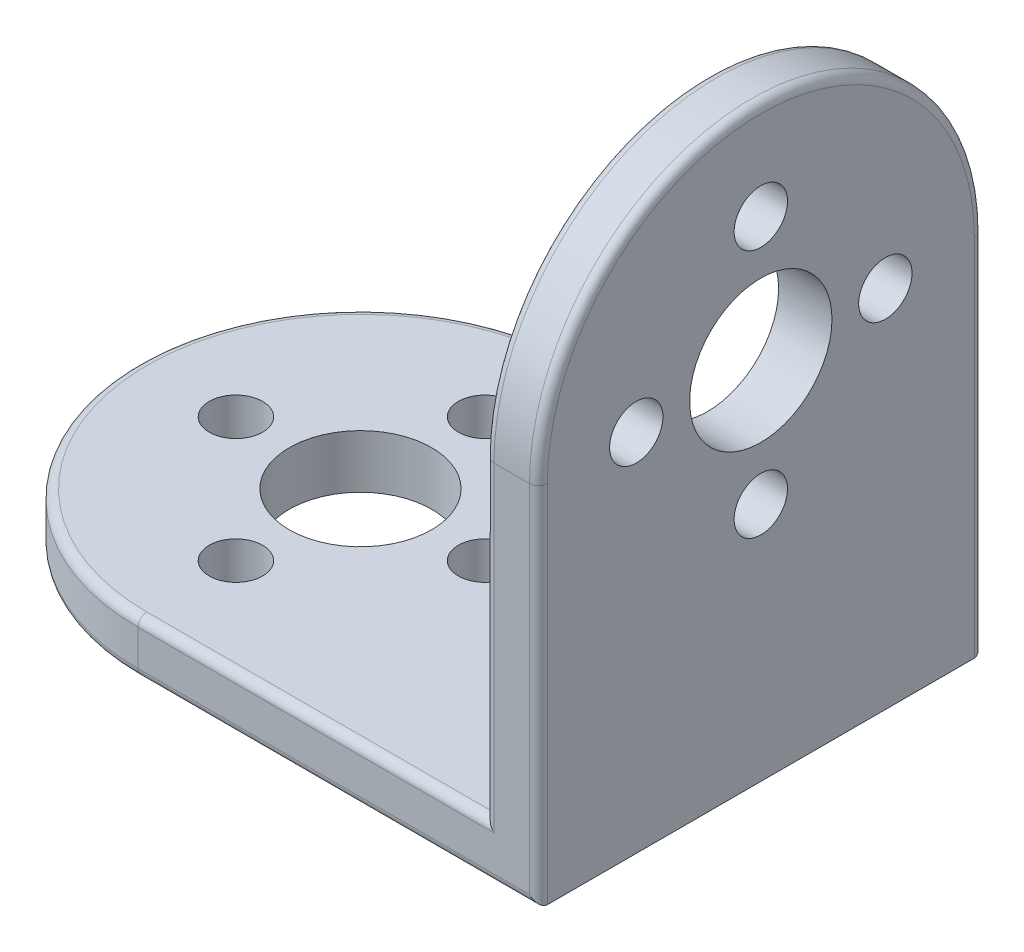
ISO-10303-21;
HEADER;
FILE_DESCRIPTION(('STEP AP214'),'2;1');
FILE_NAME('part.step','',(''),(''),'','','');
FILE_SCHEMA(('AUTOMOTIVE_DESIGN { 1 0 10303 214 1 1 1 1 }'));
ENDSEC;
DATA;
#1=APPLICATION_CONTEXT('core data for automotive mechanical design processes');
#2=APPLICATION_PROTOCOL_DEFINITION('international standard','automotive_design',2000,#1);
#3=PRODUCT_CONTEXT('',#1,'mechanical');
#4=PRODUCT('Part','Part','',(#3));
#5=PRODUCT_RELATED_PRODUCT_CATEGORY('part','',(#4));
#6=PRODUCT_DEFINITION_FORMATION('','',#4);
#7=PRODUCT_DEFINITION_CONTEXT('part definition',#1,'design');
#8=PRODUCT_DEFINITION('design','',#6,#7);
#9=PRODUCT_DEFINITION_SHAPE('','',#8);
#10=(LENGTH_UNIT() NAMED_UNIT(*) SI_UNIT(.MILLI.,.METRE.));
#11=(NAMED_UNIT(*) PLANE_ANGLE_UNIT() SI_UNIT($,.RADIAN.));
#12=(NAMED_UNIT(*) SI_UNIT($,.STERADIAN.) SOLID_ANGLE_UNIT());
#13=UNCERTAINTY_MEASURE_WITH_UNIT(LENGTH_MEASURE(1.E-05),#10,'distance_accuracy_value','');
#14=(GEOMETRIC_REPRESENTATION_CONTEXT(3) GLOBAL_UNCERTAINTY_ASSIGNED_CONTEXT((#13)) GLOBAL_UNIT_ASSIGNED_CONTEXT((#10,
#11,#12)) REPRESENTATION_CONTEXT('',''));
#15=CARTESIAN_POINT('',(0.,0.,0.));
#16=DIRECTION('',(0.,0.,1.));
#17=DIRECTION('',(1.,0.,0.));
#18=AXIS2_PLACEMENT_3D('',#15,#16,#17);
#19=CARTESIAN_POINT('',(17.5,3.,-12.5));
#20=DIRECTION('',(1.,0.,0.));
#21=DIRECTION('',(0.,0.,-1.));
#22=AXIS2_PLACEMENT_3D('',#19,#20,#21);
#23=PLANE('',#22);
#24=DIRECTION('',(0.,0.,1.));
#25=VECTOR('',#24,1.);
#26=CARTESIAN_POINT('',(17.5,0.,-12.5));
#27=LINE('',#26,#25);
#28=CARTESIAN_POINT('',(17.5,0.,-12.));
#29=VERTEX_POINT('',#28);
#30=CARTESIAN_POINT('',(17.5,0.,12.));
#31=VERTEX_POINT('',#30);
#32=EDGE_CURVE('E317',#29,#31,#27,.T.);
#33=ORIENTED_EDGE('',*,*,#32,.F.);
#34=DIRECTION('',(0.,-1.,0.));
#35=VECTOR('',#34,1.);
#36=CARTESIAN_POINT('',(17.5,3.,-12.));
#37=LINE('',#36,#35);
#38=CARTESIAN_POINT('',(17.5,20.5,-12.));
#39=VERTEX_POINT('',#38);
#40=EDGE_CURVE('E257',#29,#39,#37,.F.);
#41=ORIENTED_EDGE('',*,*,#40,.T.);
#42=CARTESIAN_POINT('',(17.5,20.5,0.));
#43=DIRECTION('',(1.,0.,0.));
#44=DIRECTION('',(0.,0.,-1.));
#45=AXIS2_PLACEMENT_3D('',#42,#43,#44);
#46=CIRCLE('',#45,12.);
#47=CARTESIAN_POINT('',(17.5,20.5,12.));
#48=VERTEX_POINT('',#47);
#49=EDGE_CURVE('E263',#39,#48,#46,.T.);
#50=ORIENTED_EDGE('',*,*,#49,.T.);
#51=DIRECTION('',(0.,-1.,0.));
#52=VECTOR('',#51,1.);
#53=CARTESIAN_POINT('',(17.5,0.,12.));
#54=LINE('',#53,#52);
#55=EDGE_CURVE('E260',#48,#31,#54,.T.);
#56=ORIENTED_EDGE('',*,*,#55,.T.);
#57=EDGE_LOOP('',(#33,#41,#50,#56));
#58=FACE_BOUND('',#57,.T.);
#59=CARTESIAN_POINT('',(17.5,27.5,0.));
#60=DIRECTION('',(1.,0.,0.));
#61=DIRECTION('',(0.,0.,-1.));
#62=AXIS2_PLACEMENT_3D('',#59,#60,#61);
#63=CIRCLE('',#62,1.49999999999999);
#64=CARTESIAN_POINT('',(17.5,27.5,-1.49999999999999));
#65=VERTEX_POINT('',#64);
#66=EDGE_CURVE('E300',#65,#65,#63,.T.);
#67=ORIENTED_EDGE('',*,*,#66,.F.);
#68=EDGE_LOOP('',(#67));
#69=FACE_BOUND('',#68,.T.);
#70=CARTESIAN_POINT('',(17.5,20.5,-7.));
#71=DIRECTION('',(1.,0.,0.));
#72=DIRECTION('',(0.,0.,-1.));
#73=AXIS2_PLACEMENT_3D('',#70,#71,#72);
#74=CIRCLE('',#73,1.49999999999999);
#75=CARTESIAN_POINT('',(17.5,20.5,-8.49999999999999));
#76=VERTEX_POINT('',#75);
#77=EDGE_CURVE('E299',#76,#76,#74,.T.);
#78=ORIENTED_EDGE('',*,*,#77,.F.);
#79=EDGE_LOOP('',(#78));
#80=FACE_BOUND('',#79,.T.);
#81=CARTESIAN_POINT('',(17.5,13.5,0.));
#82=DIRECTION('',(1.,0.,0.));
#83=DIRECTION('',(0.,0.,-1.));
#84=AXIS2_PLACEMENT_3D('',#81,#82,#83);
#85=CIRCLE('',#84,1.49999999999999);
#86=CARTESIAN_POINT('',(17.5,13.5,-1.49999999999994));
#87=VERTEX_POINT('',#86);
#88=EDGE_CURVE('E305',#87,#87,#85,.T.);
#89=ORIENTED_EDGE('',*,*,#88,.F.);
#90=EDGE_LOOP('',(#89));
#91=FACE_BOUND('',#90,.T.);
#92=CARTESIAN_POINT('',(17.5,20.5000000000001,7.));
#93=DIRECTION('',(1.,0.,0.));
#94=DIRECTION('',(0.,0.,-1.));
#95=AXIS2_PLACEMENT_3D('',#92,#93,#94);
#96=CIRCLE('',#95,1.49999999999999);
#97=CARTESIAN_POINT('',(17.5,20.5000000000001,5.50000000000001));
#98=VERTEX_POINT('',#97);
#99=EDGE_CURVE('E310',#98,#98,#96,.T.);
#100=ORIENTED_EDGE('',*,*,#99,.F.);
#101=EDGE_LOOP('',(#100));
#102=FACE_BOUND('',#101,.T.);
#103=CARTESIAN_POINT('',(17.5,20.5,0.));
#104=DIRECTION('',(1.,0.,0.));
#105=DIRECTION('',(0.,0.,-1.));
#106=AXIS2_PLACEMENT_3D('',#103,#104,#105);
#107=CIRCLE('',#106,3.99999999999999);
#108=CARTESIAN_POINT('',(17.5,20.5,-3.99999999999999));
#109=VERTEX_POINT('',#108);
#110=EDGE_CURVE('E330',#109,#109,#107,.T.);
#111=ORIENTED_EDGE('',*,*,#110,.F.);
#112=EDGE_LOOP('',(#111));
#113=FACE_BOUND('',#112,.T.);
#114=ADVANCED_FACE('F57',(#58,#69,#80,#91,#102,#113),#23,.T.);
#115=CARTESIAN_POINT('',(14.5,33.,-12.5));
#116=DIRECTION('',(1.,0.,0.));
#117=DIRECTION('',(0.,0.,-1.));
#118=AXIS2_PLACEMENT_3D('',#115,#116,#117);
#119=PLANE('',#118);
#120=CARTESIAN_POINT('',(14.5,27.5,0.));
#121=DIRECTION('',(1.,0.,0.));
#122=DIRECTION('',(0.,0.,-1.));
#123=AXIS2_PLACEMENT_3D('',#120,#121,#122);
#124=CIRCLE('',#123,1.49999999999999);
#125=CARTESIAN_POINT('',(14.5,27.5,-1.49999999999999));
#126=VERTEX_POINT('',#125);
#127=EDGE_CURVE('E295',#126,#126,#124,.T.);
#128=ORIENTED_EDGE('',*,*,#127,.T.);
#129=EDGE_LOOP('',(#128));
#130=FACE_BOUND('',#129,.T.);
#131=CARTESIAN_POINT('',(14.5,20.5,-7.));
#132=DIRECTION('',(1.,0.,0.));
#133=DIRECTION('',(0.,0.,-1.));
#134=AXIS2_PLACEMENT_3D('',#131,#132,#133);
#135=CIRCLE('',#134,1.49999999999999);
#136=CARTESIAN_POINT('',(14.5,20.5,-8.49999999999999));
#137=VERTEX_POINT('',#136);
#138=EDGE_CURVE('E301',#137,#137,#135,.T.);
#139=ORIENTED_EDGE('',*,*,#138,.T.);
#140=EDGE_LOOP('',(#139));
#141=FACE_BOUND('',#140,.T.);
#142=CARTESIAN_POINT('',(14.5,13.5,0.));
#143=DIRECTION('',(1.,0.,0.));
#144=DIRECTION('',(0.,0.,-1.));
#145=AXIS2_PLACEMENT_3D('',#142,#143,#144);
#146=CIRCLE('',#145,1.49999999999999);
#147=CARTESIAN_POINT('',(14.5,13.5,-1.49999999999994));
#148=VERTEX_POINT('',#147);
#149=EDGE_CURVE('E306',#148,#148,#146,.T.);
#150=ORIENTED_EDGE('',*,*,#149,.T.);
#151=EDGE_LOOP('',(#150));
#152=FACE_BOUND('',#151,.T.);
#153=CARTESIAN_POINT('',(14.5,20.5000000000001,7.));
#154=DIRECTION('',(1.,0.,0.));
#155=DIRECTION('',(0.,0.,-1.));
#156=AXIS2_PLACEMENT_3D('',#153,#154,#155);
#157=CIRCLE('',#156,1.49999999999999);
#158=CARTESIAN_POINT('',(14.5,20.5000000000001,5.50000000000001));
#159=VERTEX_POINT('',#158);
#160=EDGE_CURVE('E342',#159,#159,#157,.T.);
#161=ORIENTED_EDGE('',*,*,#160,.T.);
#162=EDGE_LOOP('',(#161));
#163=FACE_BOUND('',#162,.T.);
#164=CARTESIAN_POINT('',(14.5,20.5,0.));
#165=DIRECTION('',(1.,0.,0.));
#166=DIRECTION('',(0.,0.,-1.));
#167=AXIS2_PLACEMENT_3D('',#164,#165,#166);
#168=CIRCLE('',#167,3.99999999999999);
#169=CARTESIAN_POINT('',(14.5,20.5,-3.99999999999999));
#170=VERTEX_POINT('',#169);
#171=EDGE_CURVE('E171',#170,#170,#168,.T.);
#172=ORIENTED_EDGE('',*,*,#171,.T.);
#173=EDGE_LOOP('',(#172));
#174=FACE_BOUND('',#173,.T.);
#175=CARTESIAN_POINT('',(14.5,20.5,0.));
#176=DIRECTION('',(1.,0.,0.));
#177=DIRECTION('',(0.,0.,-1.));
#178=AXIS2_PLACEMENT_3D('',#175,#176,#177);
#179=CIRCLE('',#178,12.);
#180=CARTESIAN_POINT('',(14.5,20.5,12.));
#181=VERTEX_POINT('',#180);
#182=CARTESIAN_POINT('',(14.5,20.5,-12.));
#183=VERTEX_POINT('',#182);
#184=EDGE_CURVE('E254',#181,#183,#179,.F.);
#185=ORIENTED_EDGE('',*,*,#184,.T.);
#186=DIRECTION('',(0.,-1.,0.));
#187=VECTOR('',#186,1.);
#188=CARTESIAN_POINT('',(14.5,3.,-12.));
#189=LINE('',#188,#187);
#190=CARTESIAN_POINT('',(14.5,3.,-12.));
#191=VERTEX_POINT('',#190);
#192=EDGE_CURVE('E183',#183,#191,#189,.T.);
#193=ORIENTED_EDGE('',*,*,#192,.T.);
#194=DIRECTION('',(0.,0.,1.));
#195=VECTOR('',#194,1.);
#196=CARTESIAN_POINT('',(14.5,3.,-12.5));
#197=LINE('',#196,#195);
#198=CARTESIAN_POINT('',(14.5,3.,12.));
#199=VERTEX_POINT('',#198);
#200=EDGE_CURVE('E321',#191,#199,#197,.T.);
#201=ORIENTED_EDGE('',*,*,#200,.T.);
#202=DIRECTION('',(0.,-1.,0.));
#203=VECTOR('',#202,1.);
#204=CARTESIAN_POINT('',(14.5,33.,12.));
#205=LINE('',#204,#203);
#206=EDGE_CURVE('E251',#199,#181,#205,.F.);
#207=ORIENTED_EDGE('',*,*,#206,.T.);
#208=EDGE_LOOP('',(#185,#193,#201,#207));
#209=FACE_BOUND('',#208,.T.);
#210=ADVANCED_FACE('F422',(#130,#141,#152,#163,#174,#209),#119,.F.);
#211=CARTESIAN_POINT('',(-5.,3.,-12.5));
#212=DIRECTION('',(0.,0.,-1.));
#213=DIRECTION('',(-1.,0.,0.));
#214=AXIS2_PLACEMENT_3D('',#211,#212,#213);
#215=PLANE('',#214);
#216=DIRECTION('',(0.,-1.,0.));
#217=VECTOR('',#216,1.);
#218=CARTESIAN_POINT('',(17.,3.,-12.5));
#219=LINE('',#218,#217);
#220=CARTESIAN_POINT('',(17.,20.5,-12.5));
#221=VERTEX_POINT('',#220);
#222=CARTESIAN_POINT('',(17.,0.5,-12.5));
#223=VERTEX_POINT('',#222);
#224=EDGE_CURVE('E290',#221,#223,#219,.T.);
#225=ORIENTED_EDGE('',*,*,#224,.T.);
#226=DIRECTION('',(1.,0.,0.));
#227=VECTOR('',#226,1.);
#228=CARTESIAN_POINT('',(-5.,0.5,-12.5));
#229=LINE('',#228,#227);
#230=CARTESIAN_POINT('',(-5.,0.5,-12.5));
#231=VERTEX_POINT('',#230);
#232=EDGE_CURVE('E286',#223,#231,#229,.F.);
#233=ORIENTED_EDGE('',*,*,#232,.T.);
#234=DIRECTION('',(0.,-1.,0.));
#235=VECTOR('',#234,1.);
#236=CARTESIAN_POINT('',(-5.,3.,-12.5));
#237=LINE('',#236,#235);
#238=CARTESIAN_POINT('',(-5.,2.5,-12.5));
#239=VERTEX_POINT('',#238);
#240=EDGE_CURVE('E313',#239,#231,#237,.T.);
#241=ORIENTED_EDGE('',*,*,#240,.F.);
#242=DIRECTION('',(1.,0.,0.));
#243=VECTOR('',#242,1.);
#244=CARTESIAN_POINT('',(-5.,2.5,-12.5));
#245=LINE('',#244,#243);
#246=CARTESIAN_POINT('',(15.,2.5,-12.5));
#247=VERTEX_POINT('',#246);
#248=EDGE_CURVE('E157',#239,#247,#245,.T.);
#249=ORIENTED_EDGE('',*,*,#248,.T.);
#250=DIRECTION('',(0.,-1.,0.));
#251=VECTOR('',#250,1.);
#252=CARTESIAN_POINT('',(15.,20.5,-12.5));
#253=LINE('',#252,#251);
#254=CARTESIAN_POINT('',(15.,20.5,-12.5));
#255=VERTEX_POINT('',#254);
#256=EDGE_CURVE('E150',#247,#255,#253,.F.);
#257=ORIENTED_EDGE('',*,*,#256,.T.);
#258=DIRECTION('',(1.,0.,0.));
#259=VECTOR('',#258,1.);
#260=CARTESIAN_POINT('',(14.5,20.5,-12.5));
#261=LINE('',#260,#259);
#262=EDGE_CURVE('E153',#255,#221,#261,.T.);
#263=ORIENTED_EDGE('',*,*,#262,.T.);
#264=EDGE_LOOP('',(#225,#233,#241,#249,#257,#263));
#265=FACE_BOUND('',#264,.T.);
#266=ADVANCED_FACE('F152',(#265),#215,.T.);
#267=CARTESIAN_POINT('',(-5.,3.,12.5));
#268=DIRECTION('',(0.,0.,-1.));
#269=DIRECTION('',(-1.,0.,0.));
#270=AXIS2_PLACEMENT_3D('',#267,#268,#269);
#271=PLANE('',#270);
#272=DIRECTION('',(1.,0.,0.));
#273=VECTOR('',#272,1.);
#274=CARTESIAN_POINT('',(-5.,0.5,12.5));
#275=LINE('',#274,#273);
#276=CARTESIAN_POINT('',(-5.,0.5,12.5));
#277=VERTEX_POINT('',#276);
#278=CARTESIAN_POINT('',(17.,0.5,12.5));
#279=VERTEX_POINT('',#278);
#280=EDGE_CURVE('E75',#277,#279,#275,.T.);
#281=ORIENTED_EDGE('',*,*,#280,.T.);
#282=DIRECTION('',(0.,-1.,0.));
#283=VECTOR('',#282,1.);
#284=CARTESIAN_POINT('',(17.,20.5,12.5));
#285=LINE('',#284,#283);
#286=CARTESIAN_POINT('',(17.,20.5,12.5));
#287=VERTEX_POINT('',#286);
#288=EDGE_CURVE('E233',#279,#287,#285,.F.);
#289=ORIENTED_EDGE('',*,*,#288,.T.);
#290=DIRECTION('',(1.,0.,0.));
#291=VECTOR('',#290,1.);
#292=CARTESIAN_POINT('',(14.5,20.5,12.5));
#293=LINE('',#292,#291);
#294=CARTESIAN_POINT('',(15.,20.5,12.5));
#295=VERTEX_POINT('',#294);
#296=EDGE_CURVE('E170',#295,#287,#293,.T.);
#297=ORIENTED_EDGE('',*,*,#296,.F.);
#298=DIRECTION('',(0.,-1.,0.));
#299=VECTOR('',#298,1.);
#300=CARTESIAN_POINT('',(15.,3.,12.5));
#301=LINE('',#300,#299);
#302=CARTESIAN_POINT('',(15.,2.5,12.5));
#303=VERTEX_POINT('',#302);
#304=EDGE_CURVE('E82',#295,#303,#301,.T.);
#305=ORIENTED_EDGE('',*,*,#304,.T.);
#306=DIRECTION('',(1.,0.,0.));
#307=VECTOR('',#306,1.);
#308=CARTESIAN_POINT('',(-5.,2.5,12.5));
#309=LINE('',#308,#307);
#310=CARTESIAN_POINT('',(-5.,2.5,12.5));
#311=VERTEX_POINT('',#310);
#312=EDGE_CURVE('E238',#303,#311,#309,.F.);
#313=ORIENTED_EDGE('',*,*,#312,.T.);
#314=DIRECTION('',(0.,-1.,0.));
#315=VECTOR('',#314,1.);
#316=CARTESIAN_POINT('',(-5.,3.,12.5));
#317=LINE('',#316,#315);
#318=EDGE_CURVE('E162',#311,#277,#317,.T.);
#319=ORIENTED_EDGE('',*,*,#318,.T.);
#320=EDGE_LOOP('',(#281,#289,#297,#305,#313,#319));
#321=FACE_BOUND('',#320,.T.);
#322=ADVANCED_FACE('F430',(#321),#271,.F.);
#323=CARTESIAN_POINT('',(-5.,3.,0.));
#324=DIRECTION('',(0.,-1.,0.));
#325=DIRECTION('',(0.,0.,-1.));
#326=AXIS2_PLACEMENT_3D('',#323,#324,#325);
#327=CYLINDRICAL_SURFACE('',#326,12.5);
#328=ORIENTED_EDGE('',*,*,#318,.F.);
#329=CARTESIAN_POINT('',(-5.,2.5,0.));
#330=DIRECTION('',(0.,1.,0.));
#331=DIRECTION('',(0.,0.,1.));
#332=AXIS2_PLACEMENT_3D('',#329,#330,#331);
#333=CIRCLE('',#332,12.5);
#334=EDGE_CURVE('E243',#311,#239,#333,.F.);
#335=ORIENTED_EDGE('',*,*,#334,.T.);
#336=ORIENTED_EDGE('',*,*,#240,.T.);
#337=CARTESIAN_POINT('',(-5.,0.5,0.));
#338=DIRECTION('',(0.,1.,0.));
#339=DIRECTION('',(0.,0.,1.));
#340=AXIS2_PLACEMENT_3D('',#337,#338,#339);
#341=CIRCLE('',#340,12.5);
#342=EDGE_CURVE('E246',#231,#277,#341,.T.);
#343=ORIENTED_EDGE('',*,*,#342,.T.);
#344=EDGE_LOOP('',(#328,#335,#336,#343));
#345=FACE_BOUND('',#344,.T.);
#346=ADVANCED_FACE('F396',(#345),#327,.T.);
#347=CARTESIAN_POINT('',(-5.,3.,0.));
#348=DIRECTION('',(0.,1.,0.));
#349=DIRECTION('',(0.,0.,1.));
#350=AXIS2_PLACEMENT_3D('',#347,#348,#349);
#351=PLANE('',#350);
#352=CARTESIAN_POINT('',(-12.,3.,0.));
#353=DIRECTION('',(0.,1.,0.));
#354=DIRECTION('',(0.,0.,1.));
#355=AXIS2_PLACEMENT_3D('',#352,#353,#354);
#356=CIRCLE('',#355,1.49999999999999);
#357=CARTESIAN_POINT('',(-12.,3.,1.49999999999999));
#358=VERTEX_POINT('',#357);
#359=EDGE_CURVE('E202',#358,#358,#356,.T.);
#360=ORIENTED_EDGE('',*,*,#359,.F.);
#361=EDGE_LOOP('',(#360));
#362=FACE_BOUND('',#361,.T.);
#363=CARTESIAN_POINT('',(-4.99999999999998,3.,-7.));
#364=DIRECTION('',(0.,1.,0.));
#365=DIRECTION('',(0.,0.,1.));
#366=AXIS2_PLACEMENT_3D('',#363,#364,#365);
#367=CIRCLE('',#366,1.49999999999999);
#368=CARTESIAN_POINT('',(-4.99999999999998,3.,-5.50000000000001));
#369=VERTEX_POINT('',#368);
#370=EDGE_CURVE('E378',#369,#369,#367,.T.);
#371=ORIENTED_EDGE('',*,*,#370,.F.);
#372=EDGE_LOOP('',(#371));
#373=FACE_BOUND('',#372,.T.);
#374=CARTESIAN_POINT('',(2.,3.,0.));
#375=DIRECTION('',(0.,1.,0.));
#376=DIRECTION('',(0.,0.,1.));
#377=AXIS2_PLACEMENT_3D('',#374,#375,#376);
#378=CIRCLE('',#377,1.49999999999999);
#379=CARTESIAN_POINT('',(2.,3.,1.50000000000004));
#380=VERTEX_POINT('',#379);
#381=EDGE_CURVE('E370',#380,#380,#378,.T.);
#382=ORIENTED_EDGE('',*,*,#381,.F.);
#383=EDGE_LOOP('',(#382));
#384=FACE_BOUND('',#383,.T.);
#385=CARTESIAN_POINT('',(-5.00000000000008,3.,7.));
#386=DIRECTION('',(0.,1.,0.));
#387=DIRECTION('',(0.,0.,1.));
#388=AXIS2_PLACEMENT_3D('',#385,#386,#387);
#389=CIRCLE('',#388,1.49999999999999);
#390=CARTESIAN_POINT('',(-5.00000000000008,3.,8.49999999999999));
#391=VERTEX_POINT('',#390);
#392=EDGE_CURVE('E362',#391,#391,#389,.T.);
#393=ORIENTED_EDGE('',*,*,#392,.F.);
#394=EDGE_LOOP('',(#393));
#395=FACE_BOUND('',#394,.T.);
#396=CARTESIAN_POINT('',(-5.,3.,0.));
#397=DIRECTION('',(0.,1.,0.));
#398=DIRECTION('',(0.,0.,1.));
#399=AXIS2_PLACEMENT_3D('',#396,#397,#398);
#400=CIRCLE('',#399,3.99999999999999);
#401=CARTESIAN_POINT('',(-5.,3.,3.99999999999999));
#402=VERTEX_POINT('',#401);
#403=EDGE_CURVE('E338',#402,#402,#400,.T.);
#404=ORIENTED_EDGE('',*,*,#403,.F.);
#405=EDGE_LOOP('',(#404));
#406=FACE_BOUND('',#405,.T.);
#407=ORIENTED_EDGE('',*,*,#200,.F.);
#408=DIRECTION('',(1.,0.,0.));
#409=VECTOR('',#408,1.);
#410=CARTESIAN_POINT('',(-5.,3.,-12.));
#411=LINE('',#410,#409);
#412=CARTESIAN_POINT('',(-5.,3.,-12.));
#413=VERTEX_POINT('',#412);
#414=EDGE_CURVE('E276',#191,#413,#411,.F.);
#415=ORIENTED_EDGE('',*,*,#414,.T.);
#416=CARTESIAN_POINT('',(-5.,3.,0.));
#417=DIRECTION('',(0.,1.,0.));
#418=DIRECTION('',(0.,0.,1.));
#419=AXIS2_PLACEMENT_3D('',#416,#417,#418);
#420=CIRCLE('',#419,12.);
#421=CARTESIAN_POINT('',(-5.,3.,12.));
#422=VERTEX_POINT('',#421);
#423=EDGE_CURVE('E280',#413,#422,#420,.T.);
#424=ORIENTED_EDGE('',*,*,#423,.T.);
#425=DIRECTION('',(1.,0.,0.));
#426=VECTOR('',#425,1.);
#427=CARTESIAN_POINT('',(14.5,3.,12.));
#428=LINE('',#427,#426);
#429=EDGE_CURVE('E283',#422,#199,#428,.T.);
#430=ORIENTED_EDGE('',*,*,#429,.T.);
#431=EDGE_LOOP('',(#407,#415,#424,#430));
#432=FACE_BOUND('',#431,.T.);
#433=ADVANCED_FACE('F392',(#362,#373,#384,#395,#406,#432),#351,.T.);
#434=CARTESIAN_POINT('',(-5.,0.,0.));
#435=DIRECTION('',(0.,1.,0.));
#436=DIRECTION('',(0.,0.,1.));
#437=AXIS2_PLACEMENT_3D('',#434,#435,#436);
#438=PLANE('',#437);
#439=CARTESIAN_POINT('',(-12.,0.,0.));
#440=DIRECTION('',(0.,1.,0.));
#441=DIRECTION('',(0.,0.,1.));
#442=AXIS2_PLACEMENT_3D('',#439,#440,#441);
#443=CIRCLE('',#442,1.49999999999999);
#444=CARTESIAN_POINT('',(-12.,0.,1.49999999999999));
#445=VERTEX_POINT('',#444);
#446=EDGE_CURVE('E382',#445,#445,#443,.T.);
#447=ORIENTED_EDGE('',*,*,#446,.T.);
#448=EDGE_LOOP('',(#447));
#449=FACE_BOUND('',#448,.T.);
#450=CARTESIAN_POINT('',(-4.99999999999998,0.,-7.));
#451=DIRECTION('',(0.,1.,0.));
#452=DIRECTION('',(0.,0.,1.));
#453=AXIS2_PLACEMENT_3D('',#450,#451,#452);
#454=CIRCLE('',#453,1.49999999999999);
#455=CARTESIAN_POINT('',(-4.99999999999998,0.,-5.50000000000001));
#456=VERTEX_POINT('',#455);
#457=EDGE_CURVE('E374',#456,#456,#454,.T.);
#458=ORIENTED_EDGE('',*,*,#457,.T.);
#459=EDGE_LOOP('',(#458));
#460=FACE_BOUND('',#459,.T.);
#461=CARTESIAN_POINT('',(2.,0.,0.));
#462=DIRECTION('',(0.,1.,0.));
#463=DIRECTION('',(0.,0.,1.));
#464=AXIS2_PLACEMENT_3D('',#461,#462,#463);
#465=CIRCLE('',#464,1.49999999999999);
#466=CARTESIAN_POINT('',(2.,0.,1.50000000000004));
#467=VERTEX_POINT('',#466);
#468=EDGE_CURVE('E366',#467,#467,#465,.T.);
#469=ORIENTED_EDGE('',*,*,#468,.T.);
#470=EDGE_LOOP('',(#469));
#471=FACE_BOUND('',#470,.T.);
#472=CARTESIAN_POINT('',(-5.00000000000008,0.,7.));
#473=DIRECTION('',(0.,1.,0.));
#474=DIRECTION('',(0.,0.,1.));
#475=AXIS2_PLACEMENT_3D('',#472,#473,#474);
#476=CIRCLE('',#475,1.49999999999999);
#477=CARTESIAN_POINT('',(-5.00000000000008,0.,8.49999999999999));
#478=VERTEX_POINT('',#477);
#479=EDGE_CURVE('E358',#478,#478,#476,.T.);
#480=ORIENTED_EDGE('',*,*,#479,.T.);
#481=EDGE_LOOP('',(#480));
#482=FACE_BOUND('',#481,.T.);
#483=CARTESIAN_POINT('',(-5.,0.,0.));
#484=DIRECTION('',(0.,1.,0.));
#485=DIRECTION('',(0.,0.,1.));
#486=AXIS2_PLACEMENT_3D('',#483,#484,#485);
#487=CIRCLE('',#486,3.99999999999999);
#488=CARTESIAN_POINT('',(-5.,0.,3.99999999999999));
#489=VERTEX_POINT('',#488);
#490=EDGE_CURVE('E334',#489,#489,#487,.T.);
#491=ORIENTED_EDGE('',*,*,#490,.T.);
#492=EDGE_LOOP('',(#491));
#493=FACE_BOUND('',#492,.T.);
#494=CARTESIAN_POINT('',(-5.,0.,0.));
#495=DIRECTION('',(0.,1.,0.));
#496=DIRECTION('',(0.,0.,1.));
#497=AXIS2_PLACEMENT_3D('',#494,#495,#496);
#498=CIRCLE('',#497,12.);
#499=CARTESIAN_POINT('',(-5.,0.,12.));
#500=VERTEX_POINT('',#499);
#501=CARTESIAN_POINT('',(-5.,0.,-12.));
#502=VERTEX_POINT('',#501);
#503=EDGE_CURVE('E270',#500,#502,#498,.F.);
#504=ORIENTED_EDGE('',*,*,#503,.T.);
#505=DIRECTION('',(1.,0.,0.));
#506=VECTOR('',#505,1.);
#507=CARTESIAN_POINT('',(17.5,0.,-12.));
#508=LINE('',#507,#506);
#509=EDGE_CURVE('E266',#502,#29,#508,.T.);
#510=ORIENTED_EDGE('',*,*,#509,.T.);
#511=ORIENTED_EDGE('',*,*,#32,.T.);
#512=DIRECTION('',(1.,0.,0.));
#513=VECTOR('',#512,1.);
#514=CARTESIAN_POINT('',(-5.,0.,12.));
#515=LINE('',#514,#513);
#516=EDGE_CURVE('E273',#31,#500,#515,.F.);
#517=ORIENTED_EDGE('',*,*,#516,.T.);
#518=EDGE_LOOP('',(#504,#510,#511,#517));
#519=FACE_BOUND('',#518,.T.);
#520=ADVANCED_FACE('F395',(#449,#460,#471,#482,#493,#519),#438,.F.);
#521=CARTESIAN_POINT('',(14.5,20.5,0.));
#522=DIRECTION('',(1.,0.,0.));
#523=DIRECTION('',(0.,0.,-1.));
#524=AXIS2_PLACEMENT_3D('',#521,#522,#523);
#525=CYLINDRICAL_SURFACE('',#524,12.5);
#526=ORIENTED_EDGE('',*,*,#262,.F.);
#527=CARTESIAN_POINT('',(15.,20.5,0.));
#528=DIRECTION('',(1.,0.,0.));
#529=DIRECTION('',(0.,0.,-1.));
#530=AXIS2_PLACEMENT_3D('',#527,#528,#529);
#531=CIRCLE('',#530,12.5);
#532=EDGE_CURVE('E12',#255,#295,#531,.T.);
#533=ORIENTED_EDGE('',*,*,#532,.T.);
#534=ORIENTED_EDGE('',*,*,#296,.T.);
#535=CARTESIAN_POINT('',(17.,20.5,0.));
#536=DIRECTION('',(1.,0.,0.));
#537=DIRECTION('',(0.,0.,-1.));
#538=AXIS2_PLACEMENT_3D('',#535,#536,#537);
#539=CIRCLE('',#538,12.5);
#540=EDGE_CURVE('E67',#287,#221,#539,.F.);
#541=ORIENTED_EDGE('',*,*,#540,.T.);
#542=EDGE_LOOP('',(#526,#533,#534,#541));
#543=FACE_BOUND('',#542,.T.);
#544=ADVANCED_FACE('F166',(#543),#525,.T.);
#545=CARTESIAN_POINT('',(17.5,20.5,0.));
#546=DIRECTION('',(1.,0.,0.));
#547=DIRECTION('',(0.,0.,-1.));
#548=AXIS2_PLACEMENT_3D('',#545,#546,#547);
#549=CYLINDRICAL_SURFACE('',#548,3.99999999999999);
#550=ORIENTED_EDGE('',*,*,#110,.T.);
#551=EDGE_LOOP('',(#550));
#552=FACE_BOUND('',#551,.T.);
#553=ORIENTED_EDGE('',*,*,#171,.F.);
#554=EDGE_LOOP('',(#553));
#555=FACE_BOUND('',#554,.T.);
#556=ADVANCED_FACE('F504',(#552,#555),#549,.F.);
#557=CARTESIAN_POINT('',(-5.,3.,0.));
#558=DIRECTION('',(0.,1.,0.));
#559=DIRECTION('',(0.,0.,1.));
#560=AXIS2_PLACEMENT_3D('',#557,#558,#559);
#561=CYLINDRICAL_SURFACE('',#560,3.99999999999999);
#562=ORIENTED_EDGE('',*,*,#490,.F.);
#563=EDGE_LOOP('',(#562));
#564=FACE_BOUND('',#563,.T.);
#565=ORIENTED_EDGE('',*,*,#403,.T.);
#566=EDGE_LOOP('',(#565));
#567=FACE_BOUND('',#566,.T.);
#568=ADVANCED_FACE('F507',(#564,#567),#561,.F.);
#569=CARTESIAN_POINT('',(17.5,20.5000000000001,7.));
#570=DIRECTION('',(1.,0.,0.));
#571=DIRECTION('',(0.,0.,-1.));
#572=AXIS2_PLACEMENT_3D('',#569,#570,#571);
#573=CYLINDRICAL_SURFACE('',#572,1.49999999999999);
#574=ORIENTED_EDGE('',*,*,#99,.T.);
#575=EDGE_LOOP('',(#574));
#576=FACE_BOUND('',#575,.T.);
#577=ORIENTED_EDGE('',*,*,#160,.F.);
#578=EDGE_LOOP('',(#577));
#579=FACE_BOUND('',#578,.T.);
#580=ADVANCED_FACE('F514',(#576,#579),#573,.F.);
#581=CARTESIAN_POINT('',(17.5,13.5,0.));
#582=DIRECTION('',(1.,0.,0.));
#583=DIRECTION('',(0.,0.,-1.));
#584=AXIS2_PLACEMENT_3D('',#581,#582,#583);
#585=CYLINDRICAL_SURFACE('',#584,1.49999999999999);
#586=ORIENTED_EDGE('',*,*,#88,.T.);
#587=EDGE_LOOP('',(#586));
#588=FACE_BOUND('',#587,.T.);
#589=ORIENTED_EDGE('',*,*,#149,.F.);
#590=EDGE_LOOP('',(#589));
#591=FACE_BOUND('',#590,.T.);
#592=ADVANCED_FACE('F520',(#588,#591),#585,.F.);
#593=CARTESIAN_POINT('',(17.5,20.5,-7.));
#594=DIRECTION('',(1.,0.,0.));
#595=DIRECTION('',(0.,0.,-1.));
#596=AXIS2_PLACEMENT_3D('',#593,#594,#595);
#597=CYLINDRICAL_SURFACE('',#596,1.49999999999999);
#598=ORIENTED_EDGE('',*,*,#77,.T.);
#599=EDGE_LOOP('',(#598));
#600=FACE_BOUND('',#599,.T.);
#601=ORIENTED_EDGE('',*,*,#138,.F.);
#602=EDGE_LOOP('',(#601));
#603=FACE_BOUND('',#602,.T.);
#604=ADVANCED_FACE('F524',(#600,#603),#597,.F.);
#605=CARTESIAN_POINT('',(17.5,27.5,0.));
#606=DIRECTION('',(1.,0.,0.));
#607=DIRECTION('',(0.,0.,-1.));
#608=AXIS2_PLACEMENT_3D('',#605,#606,#607);
#609=CYLINDRICAL_SURFACE('',#608,1.49999999999999);
#610=ORIENTED_EDGE('',*,*,#66,.T.);
#611=EDGE_LOOP('',(#610));
#612=FACE_BOUND('',#611,.T.);
#613=ORIENTED_EDGE('',*,*,#127,.F.);
#614=EDGE_LOOP('',(#613));
#615=FACE_BOUND('',#614,.T.);
#616=ADVANCED_FACE('F528',(#612,#615),#609,.F.);
#617=CARTESIAN_POINT('',(-5.00000000000008,3.,7.));
#618=DIRECTION('',(0.,1.,0.));
#619=DIRECTION('',(0.,0.,1.));
#620=AXIS2_PLACEMENT_3D('',#617,#618,#619);
#621=CYLINDRICAL_SURFACE('',#620,1.49999999999999);
#622=ORIENTED_EDGE('',*,*,#479,.F.);
#623=EDGE_LOOP('',(#622));
#624=FACE_BOUND('',#623,.T.);
#625=ORIENTED_EDGE('',*,*,#392,.T.);
#626=EDGE_LOOP('',(#625));
#627=FACE_BOUND('',#626,.T.);
#628=ADVANCED_FACE('F532',(#624,#627),#621,.F.);
#629=CARTESIAN_POINT('',(2.,3.,0.));
#630=DIRECTION('',(0.,1.,0.));
#631=DIRECTION('',(0.,0.,1.));
#632=AXIS2_PLACEMENT_3D('',#629,#630,#631);
#633=CYLINDRICAL_SURFACE('',#632,1.49999999999999);
#634=ORIENTED_EDGE('',*,*,#468,.F.);
#635=EDGE_LOOP('',(#634));
#636=FACE_BOUND('',#635,.T.);
#637=ORIENTED_EDGE('',*,*,#381,.T.);
#638=EDGE_LOOP('',(#637));
#639=FACE_BOUND('',#638,.T.);
#640=ADVANCED_FACE('F536',(#636,#639),#633,.F.);
#641=CARTESIAN_POINT('',(-4.99999999999998,3.,-7.));
#642=DIRECTION('',(0.,1.,0.));
#643=DIRECTION('',(0.,0.,1.));
#644=AXIS2_PLACEMENT_3D('',#641,#642,#643);
#645=CYLINDRICAL_SURFACE('',#644,1.49999999999999);
#646=ORIENTED_EDGE('',*,*,#457,.F.);
#647=EDGE_LOOP('',(#646));
#648=FACE_BOUND('',#647,.T.);
#649=ORIENTED_EDGE('',*,*,#370,.T.);
#650=EDGE_LOOP('',(#649));
#651=FACE_BOUND('',#650,.T.);
#652=ADVANCED_FACE('F540',(#648,#651),#645,.F.);
#653=CARTESIAN_POINT('',(-12.,3.,0.));
#654=DIRECTION('',(0.,1.,0.));
#655=DIRECTION('',(0.,0.,1.));
#656=AXIS2_PLACEMENT_3D('',#653,#654,#655);
#657=CYLINDRICAL_SURFACE('',#656,1.49999999999999);
#658=ORIENTED_EDGE('',*,*,#446,.F.);
#659=EDGE_LOOP('',(#658));
#660=FACE_BOUND('',#659,.T.);
#661=ORIENTED_EDGE('',*,*,#359,.T.);
#662=EDGE_LOOP('',(#661));
#663=FACE_BOUND('',#662,.T.);
#664=ADVANCED_FACE('F390',(#660,#663),#657,.F.);
#665=CARTESIAN_POINT('',(15.,3.,12.));
#666=DIRECTION('',(0.,-1.,0.));
#667=DIRECTION('',(0.,0.,-1.));
#668=AXIS2_PLACEMENT_3D('',#665,#666,#667);
#669=CYLINDRICAL_SURFACE('',#668,0.5);
#670=CARTESIAN_POINT('',(15.,20.5,12.));
#671=DIRECTION('',(0.,1.,0.));
#672=DIRECTION('',(0.,0.,1.));
#673=AXIS2_PLACEMENT_3D('',#670,#671,#672);
#674=CIRCLE('',#673,0.5);
#675=EDGE_CURVE('E181',#181,#295,#674,.T.);
#676=ORIENTED_EDGE('',*,*,#675,.F.);
#677=ORIENTED_EDGE('',*,*,#206,.F.);
#678=CARTESIAN_POINT('',(15.,2.5,12.));
#679=DIRECTION('',(-0.707106781186547,-0.707106781186547,0.));
#680=DIRECTION('',(-0.707106781186547,0.707106781186547,0.));
#681=AXIS2_PLACEMENT_3D('',#678,#679,#680);
#682=ELLIPSE('',#681,0.707106781186547,0.5);
#683=EDGE_CURVE('E198',#303,#199,#682,.T.);
#684=ORIENTED_EDGE('',*,*,#683,.F.);
#685=ORIENTED_EDGE('',*,*,#304,.F.);
#686=EDGE_LOOP('',(#676,#677,#684,#685));
#687=FACE_BOUND('',#686,.T.);
#688=ADVANCED_FACE('F421',(#687),#669,.T.);
#689=CARTESIAN_POINT('',(-5.,2.5,12.));
#690=DIRECTION('',(-1.,0.,0.));
#691=DIRECTION('',(0.,0.,1.));
#692=AXIS2_PLACEMENT_3D('',#689,#690,#691);
#693=CYLINDRICAL_SURFACE('',#692,0.5);
#694=ORIENTED_EDGE('',*,*,#683,.T.);
#695=ORIENTED_EDGE('',*,*,#429,.F.);
#696=CARTESIAN_POINT('',(-5.,2.5,12.));
#697=DIRECTION('',(-1.,0.,0.));
#698=DIRECTION('',(0.,0.,1.));
#699=AXIS2_PLACEMENT_3D('',#696,#697,#698);
#700=CIRCLE('',#699,0.5);
#701=EDGE_CURVE('E185',#311,#422,#700,.T.);
#702=ORIENTED_EDGE('',*,*,#701,.F.);
#703=ORIENTED_EDGE('',*,*,#312,.F.);
#704=EDGE_LOOP('',(#694,#695,#702,#703));
#705=FACE_BOUND('',#704,.T.);
#706=ADVANCED_FACE('F418',(#705),#693,.T.);
#707=CARTESIAN_POINT('',(15.,20.5,0.));
#708=DIRECTION('',(1.,0.,0.));
#709=DIRECTION('',(0.,0.,-1.));
#710=AXIS2_PLACEMENT_3D('',#707,#708,#709);
#711=TOROIDAL_SURFACE('',#710,12.,0.5);
#712=ORIENTED_EDGE('',*,*,#675,.T.);
#713=ORIENTED_EDGE('',*,*,#532,.F.);
#714=CARTESIAN_POINT('',(15.,20.5,-12.));
#715=DIRECTION('',(0.,-1.,0.));
#716=DIRECTION('',(0.,0.,-1.));
#717=AXIS2_PLACEMENT_3D('',#714,#715,#716);
#718=CIRCLE('',#717,0.5);
#719=EDGE_CURVE('E178',#183,#255,#718,.T.);
#720=ORIENTED_EDGE('',*,*,#719,.F.);
#721=ORIENTED_EDGE('',*,*,#184,.F.);
#722=EDGE_LOOP('',(#712,#713,#720,#721));
#723=FACE_BOUND('',#722,.T.);
#724=ADVANCED_FACE('F176',(#723),#711,.T.);
#725=CARTESIAN_POINT('',(-5.,2.5,0.));
#726=DIRECTION('',(0.,1.,0.));
#727=DIRECTION('',(0.,0.,1.));
#728=AXIS2_PLACEMENT_3D('',#725,#726,#727);
#729=TOROIDAL_SURFACE('',#728,12.,0.5);
#730=ORIENTED_EDGE('',*,*,#701,.T.);
#731=ORIENTED_EDGE('',*,*,#423,.F.);
#732=CARTESIAN_POINT('',(-5.,2.5,-12.));
#733=DIRECTION('',(1.,0.,0.));
#734=DIRECTION('',(0.,0.,-1.));
#735=AXIS2_PLACEMENT_3D('',#732,#733,#734);
#736=CIRCLE('',#735,0.5);
#737=EDGE_CURVE('E186',#239,#413,#736,.T.);
#738=ORIENTED_EDGE('',*,*,#737,.F.);
#739=ORIENTED_EDGE('',*,*,#334,.F.);
#740=EDGE_LOOP('',(#730,#731,#738,#739));
#741=FACE_BOUND('',#740,.T.);
#742=ADVANCED_FACE('F415',(#741),#729,.T.);
#743=CARTESIAN_POINT('',(15.,33.,-12.));
#744=DIRECTION('',(0.,1.,0.));
#745=DIRECTION('',(0.,0.,1.));
#746=AXIS2_PLACEMENT_3D('',#743,#744,#745);
#747=CYLINDRICAL_SURFACE('',#746,0.5);
#748=ORIENTED_EDGE('',*,*,#719,.T.);
#749=ORIENTED_EDGE('',*,*,#256,.F.);
#750=CARTESIAN_POINT('',(15.,2.5,-12.));
#751=DIRECTION('',(0.707106781186547,0.707106781186547,0.));
#752=DIRECTION('',(0.707106781186547,-0.707106781186547,0.));
#753=AXIS2_PLACEMENT_3D('',#750,#751,#752);
#754=ELLIPSE('',#753,0.707106781186547,0.5);
#755=EDGE_CURVE('E192',#191,#247,#754,.F.);
#756=ORIENTED_EDGE('',*,*,#755,.F.);
#757=ORIENTED_EDGE('',*,*,#192,.F.);
#758=EDGE_LOOP('',(#748,#749,#756,#757));
#759=FACE_BOUND('',#758,.T.);
#760=ADVANCED_FACE('F182',(#759),#747,.T.);
#761=CARTESIAN_POINT('',(-5.,2.5,-12.));
#762=DIRECTION('',(1.,0.,0.));
#763=DIRECTION('',(0.,0.,-1.));
#764=AXIS2_PLACEMENT_3D('',#761,#762,#763);
#765=CYLINDRICAL_SURFACE('',#764,0.5);
#766=ORIENTED_EDGE('',*,*,#737,.T.);
#767=ORIENTED_EDGE('',*,*,#414,.F.);
#768=ORIENTED_EDGE('',*,*,#755,.T.);
#769=ORIENTED_EDGE('',*,*,#248,.F.);
#770=EDGE_LOOP('',(#766,#767,#768,#769));
#771=FACE_BOUND('',#770,.T.);
#772=ADVANCED_FACE('F410',(#771),#765,.T.);
#773=CARTESIAN_POINT('',(17.,3.,12.));
#774=DIRECTION('',(0.,1.,0.));
#775=DIRECTION('',(0.,0.,1.));
#776=AXIS2_PLACEMENT_3D('',#773,#774,#775);
#777=CYLINDRICAL_SURFACE('',#776,0.5);
#778=CARTESIAN_POINT('',(17.,20.5,12.));
#779=DIRECTION('',(0.,1.,0.));
#780=DIRECTION('',(0.,0.,1.));
#781=AXIS2_PLACEMENT_3D('',#778,#779,#780);
#782=CIRCLE('',#781,0.5);
#783=EDGE_CURVE('E216',#287,#48,#782,.T.);
#784=ORIENTED_EDGE('',*,*,#783,.F.);
#785=ORIENTED_EDGE('',*,*,#288,.F.);
#786=CARTESIAN_POINT('',(17.,0.5,12.));
#787=DIRECTION('',(0.707106781186547,0.707106781186547,0.));
#788=DIRECTION('',(0.707106781186547,-0.707106781186547,0.));
#789=AXIS2_PLACEMENT_3D('',#786,#787,#788);
#790=ELLIPSE('',#789,0.707106781186547,0.5);
#791=EDGE_CURVE('E61',#31,#279,#790,.F.);
#792=ORIENTED_EDGE('',*,*,#791,.F.);
#793=ORIENTED_EDGE('',*,*,#55,.F.);
#794=EDGE_LOOP('',(#784,#785,#792,#793));
#795=FACE_BOUND('',#794,.T.);
#796=ADVANCED_FACE('F59',(#795),#777,.T.);
#797=CARTESIAN_POINT('',(-5.,0.5,12.));
#798=DIRECTION('',(1.,0.,0.));
#799=DIRECTION('',(0.,0.,-1.));
#800=AXIS2_PLACEMENT_3D('',#797,#798,#799);
#801=CYLINDRICAL_SURFACE('',#800,0.5);
#802=ORIENTED_EDGE('',*,*,#791,.T.);
#803=ORIENTED_EDGE('',*,*,#280,.F.);
#804=CARTESIAN_POINT('',(-5.,0.5,12.));
#805=DIRECTION('',(-1.,0.,0.));
#806=DIRECTION('',(0.,0.,1.));
#807=AXIS2_PLACEMENT_3D('',#804,#805,#806);
#808=CIRCLE('',#807,0.5);
#809=EDGE_CURVE('E213',#500,#277,#808,.T.);
#810=ORIENTED_EDGE('',*,*,#809,.F.);
#811=ORIENTED_EDGE('',*,*,#516,.F.);
#812=EDGE_LOOP('',(#802,#803,#810,#811));
#813=FACE_BOUND('',#812,.T.);
#814=ADVANCED_FACE('F472',(#813),#801,.T.);
#815=CARTESIAN_POINT('',(17.,20.5,0.));
#816=DIRECTION('',(1.,0.,0.));
#817=DIRECTION('',(0.,0.,-1.));
#818=AXIS2_PLACEMENT_3D('',#815,#816,#817);
#819=TOROIDAL_SURFACE('',#818,12.,0.5);
#820=ORIENTED_EDGE('',*,*,#783,.T.);
#821=ORIENTED_EDGE('',*,*,#49,.F.);
#822=CARTESIAN_POINT('',(17.,20.5,-12.));
#823=DIRECTION('',(0.,-1.,0.));
#824=DIRECTION('',(0.,0.,-1.));
#825=AXIS2_PLACEMENT_3D('',#822,#823,#824);
#826=CIRCLE('',#825,0.5);
#827=EDGE_CURVE('E209',#221,#39,#826,.T.);
#828=ORIENTED_EDGE('',*,*,#827,.F.);
#829=ORIENTED_EDGE('',*,*,#540,.F.);
#830=EDGE_LOOP('',(#820,#821,#828,#829));
#831=FACE_BOUND('',#830,.T.);
#832=ADVANCED_FACE('F469',(#831),#819,.T.);
#833=CARTESIAN_POINT('',(-5.,0.5,0.));
#834=DIRECTION('',(0.,1.,0.));
#835=DIRECTION('',(0.,0.,1.));
#836=AXIS2_PLACEMENT_3D('',#833,#834,#835);
#837=TOROIDAL_SURFACE('',#836,12.,0.5);
#838=ORIENTED_EDGE('',*,*,#809,.T.);
#839=ORIENTED_EDGE('',*,*,#342,.F.);
#840=CARTESIAN_POINT('',(-5.,0.5,-12.));
#841=DIRECTION('',(1.,0.,0.));
#842=DIRECTION('',(0.,0.,-1.));
#843=AXIS2_PLACEMENT_3D('',#840,#841,#842);
#844=CIRCLE('',#843,0.5);
#845=EDGE_CURVE('E206',#502,#231,#844,.T.);
#846=ORIENTED_EDGE('',*,*,#845,.F.);
#847=ORIENTED_EDGE('',*,*,#503,.F.);
#848=EDGE_LOOP('',(#838,#839,#846,#847));
#849=FACE_BOUND('',#848,.T.);
#850=ADVANCED_FACE('F465',(#849),#837,.T.);
#851=CARTESIAN_POINT('',(17.,3.,-12.));
#852=DIRECTION('',(0.,-1.,0.));
#853=DIRECTION('',(0.,0.,-1.));
#854=AXIS2_PLACEMENT_3D('',#851,#852,#853);
#855=CYLINDRICAL_SURFACE('',#854,0.5);
#856=ORIENTED_EDGE('',*,*,#827,.T.);
#857=ORIENTED_EDGE('',*,*,#40,.F.);
#858=CARTESIAN_POINT('',(17.,0.5,-12.));
#859=DIRECTION('',(-0.707106781186547,-0.707106781186547,0.));
#860=DIRECTION('',(0.707106781186547,-0.707106781186547,0.));
#861=AXIS2_PLACEMENT_3D('',#858,#859,#860);
#862=ELLIPSE('',#861,0.707106781186547,0.5);
#863=EDGE_CURVE('E203',#223,#29,#862,.T.);
#864=ORIENTED_EDGE('',*,*,#863,.F.);
#865=ORIENTED_EDGE('',*,*,#224,.F.);
#866=EDGE_LOOP('',(#856,#857,#864,#865));
#867=FACE_BOUND('',#866,.T.);
#868=ADVANCED_FACE('F461',(#867),#855,.T.);
#869=CARTESIAN_POINT('',(-5.,0.5,-12.));
#870=DIRECTION('',(-1.,0.,0.));
#871=DIRECTION('',(0.,0.,1.));
#872=AXIS2_PLACEMENT_3D('',#869,#870,#871);
#873=CYLINDRICAL_SURFACE('',#872,0.5);
#874=ORIENTED_EDGE('',*,*,#845,.T.);
#875=ORIENTED_EDGE('',*,*,#232,.F.);
#876=ORIENTED_EDGE('',*,*,#863,.T.);
#877=ORIENTED_EDGE('',*,*,#509,.F.);
#878=EDGE_LOOP('',(#874,#875,#876,#877));
#879=FACE_BOUND('',#878,.T.);
#880=ADVANCED_FACE('F458',(#879),#873,.T.);
#881=CLOSED_SHELL('',(#114,#210,#266,#322,#346,#433,#520,#544,#556,#568,#580,#592,#604,#616,
#628,#640,#652,#664,#688,#706,#724,#742,#760,#772,#796,#814,#832,#850,#868,#880));
#882=MANIFOLD_SOLID_BREP('B2',#881);
#883=ADVANCED_BREP_SHAPE_REPRESENTATION('',(#18,#882),#14);
#884=SHAPE_DEFINITION_REPRESENTATION(#9,#883);
ENDSEC;
END-ISO-10303-21;
